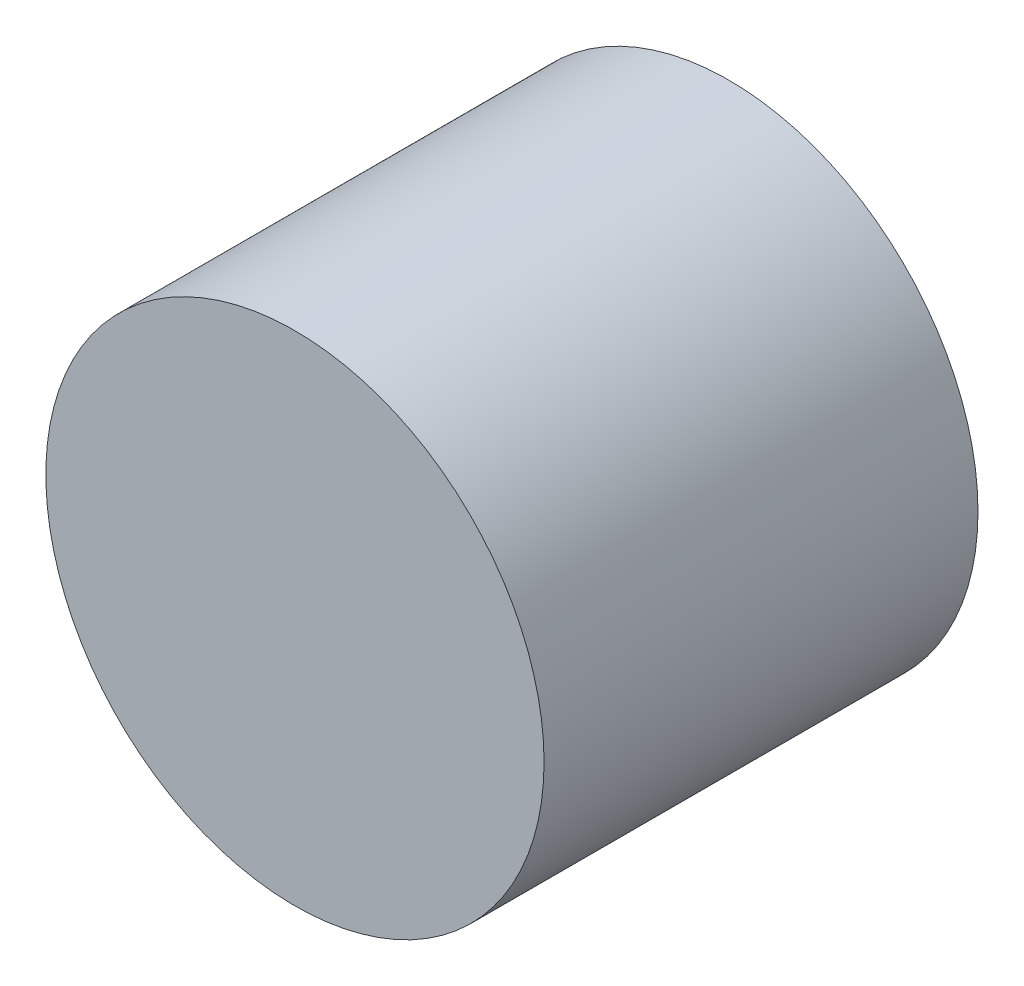
ISO-10303-21;
HEADER;
FILE_DESCRIPTION(('STEP AP214'),'2;1');
FILE_NAME('part.step','',(''),(''),'','','');
FILE_SCHEMA(('AUTOMOTIVE_DESIGN { 1 0 10303 214 1 1 1 1 }'));
ENDSEC;
DATA;
#1=APPLICATION_CONTEXT('core data for automotive mechanical design processes');
#2=APPLICATION_PROTOCOL_DEFINITION('international standard','automotive_design',2000,#1);
#3=PRODUCT_CONTEXT('',#1,'mechanical');
#4=PRODUCT('Part','Part','',(#3));
#5=PRODUCT_RELATED_PRODUCT_CATEGORY('part','',(#4));
#6=PRODUCT_DEFINITION_FORMATION('','',#4);
#7=PRODUCT_DEFINITION_CONTEXT('part definition',#1,'design');
#8=PRODUCT_DEFINITION('design','',#6,#7);
#9=PRODUCT_DEFINITION_SHAPE('','',#8);
#10=(LENGTH_UNIT() NAMED_UNIT(*) SI_UNIT(.MILLI.,.METRE.));
#11=(NAMED_UNIT(*) PLANE_ANGLE_UNIT() SI_UNIT($,.RADIAN.));
#12=(NAMED_UNIT(*) SI_UNIT($,.STERADIAN.) SOLID_ANGLE_UNIT());
#13=UNCERTAINTY_MEASURE_WITH_UNIT(LENGTH_MEASURE(1.E-05),#10,'distance_accuracy_value','');
#14=(GEOMETRIC_REPRESENTATION_CONTEXT(3) GLOBAL_UNCERTAINTY_ASSIGNED_CONTEXT((#13)) GLOBAL_UNIT_ASSIGNED_CONTEXT((#10,
#11,#12)) REPRESENTATION_CONTEXT('',''));
#15=CARTESIAN_POINT('',(0.,0.,0.));
#16=DIRECTION('',(0.,0.,1.));
#17=DIRECTION('',(1.,0.,0.));
#18=AXIS2_PLACEMENT_3D('',#15,#16,#17);
#19=CARTESIAN_POINT('',(0.,0.,6.75));
#20=DIRECTION('',(0.,0.,-1.));
#21=DIRECTION('',(-1.,0.,0.));
#22=AXIS2_PLACEMENT_3D('',#19,#20,#21);
#23=CYLINDRICAL_SURFACE('',#22,3.875);
#24=CARTESIAN_POINT('',(0.,0.,6.75));
#25=DIRECTION('',(0.,0.,1.));
#26=DIRECTION('',(1.,0.,0.));
#27=AXIS2_PLACEMENT_3D('',#24,#25,#26);
#28=CIRCLE('',#27,3.875);
#29=CARTESIAN_POINT('',(3.875,0.,6.75));
#30=VERTEX_POINT('',#29);
#31=EDGE_CURVE('E10',#30,#30,#28,.T.);
#32=ORIENTED_EDGE('',*,*,#31,.F.);
#33=EDGE_LOOP('',(#32));
#34=FACE_BOUND('',#33,.T.);
#35=CARTESIAN_POINT('',(0.,0.,0.));
#36=DIRECTION('',(0.,0.,1.));
#37=DIRECTION('',(1.,0.,0.));
#38=AXIS2_PLACEMENT_3D('',#35,#36,#37);
#39=CIRCLE('',#38,3.875);
#40=CARTESIAN_POINT('',(3.875,0.,0.));
#41=VERTEX_POINT('',#40);
#42=EDGE_CURVE('E34',#41,#41,#39,.T.);
#43=ORIENTED_EDGE('',*,*,#42,.T.);
#44=EDGE_LOOP('',(#43));
#45=FACE_BOUND('',#44,.T.);
#46=ADVANCED_FACE('F31',(#34,#45),#23,.T.);
#47=CARTESIAN_POINT('',(0.,0.,6.75));
#48=DIRECTION('',(0.,0.,1.));
#49=DIRECTION('',(1.,0.,0.));
#50=AXIS2_PLACEMENT_3D('',#47,#48,#49);
#51=PLANE('',#50);
#52=ORIENTED_EDGE('',*,*,#31,.T.);
#53=EDGE_LOOP('',(#52));
#54=FACE_BOUND('',#53,.T.);
#55=ADVANCED_FACE('F46',(#54),#51,.T.);
#56=CARTESIAN_POINT('',(0.,0.,0.));
#57=DIRECTION('',(0.,0.,1.));
#58=DIRECTION('',(1.,0.,0.));
#59=AXIS2_PLACEMENT_3D('',#56,#57,#58);
#60=PLANE('',#59);
#61=ORIENTED_EDGE('',*,*,#42,.F.);
#62=EDGE_LOOP('',(#61));
#63=FACE_BOUND('',#62,.T.);
#64=ADVANCED_FACE('F44',(#63),#60,.F.);
#65=CLOSED_SHELL('',(#46,#55,#64));
#66=MANIFOLD_SOLID_BREP('B2',#65);
#67=ADVANCED_BREP_SHAPE_REPRESENTATION('',(#18,#66),#14);
#68=SHAPE_DEFINITION_REPRESENTATION(#9,#67);
ENDSEC;
END-ISO-10303-21;
